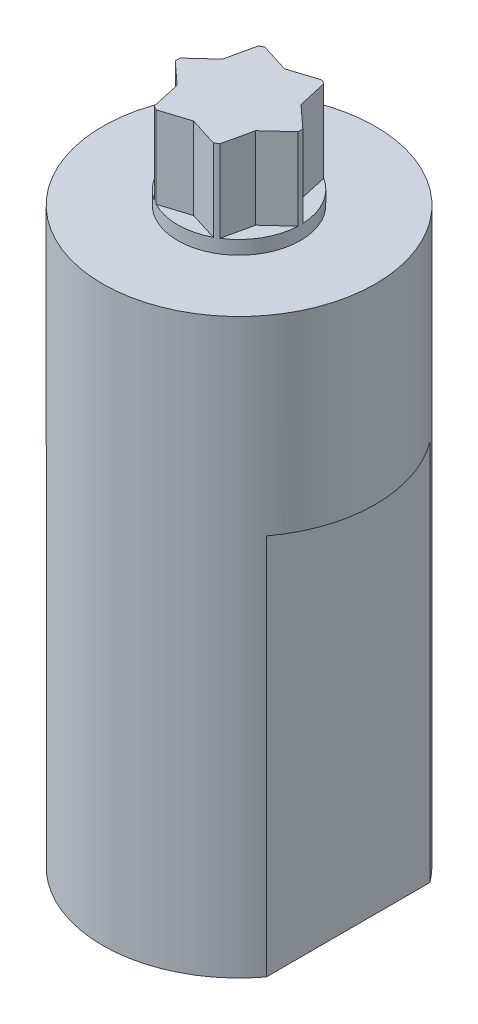
ISO-10303-21;
HEADER;
FILE_DESCRIPTION(('STEP AP214'),'2;1');
FILE_NAME('part.step','',(''),(''),'','','');
FILE_SCHEMA(('AUTOMOTIVE_DESIGN { 1 0 10303 214 1 1 1 1 }'));
ENDSEC;
DATA;
#1=APPLICATION_CONTEXT('core data for automotive mechanical design processes');
#2=APPLICATION_PROTOCOL_DEFINITION('international standard','automotive_design',2000,#1);
#3=PRODUCT_CONTEXT('',#1,'mechanical');
#4=PRODUCT('Part','Part','',(#3));
#5=PRODUCT_RELATED_PRODUCT_CATEGORY('part','',(#4));
#6=PRODUCT_DEFINITION_FORMATION('','',#4);
#7=PRODUCT_DEFINITION_CONTEXT('part definition',#1,'design');
#8=PRODUCT_DEFINITION('design','',#6,#7);
#9=PRODUCT_DEFINITION_SHAPE('','',#8);
#10=(LENGTH_UNIT() NAMED_UNIT(*) SI_UNIT(.MILLI.,.METRE.));
#11=(NAMED_UNIT(*) PLANE_ANGLE_UNIT() SI_UNIT($,.RADIAN.));
#12=(NAMED_UNIT(*) SI_UNIT($,.STERADIAN.) SOLID_ANGLE_UNIT());
#13=UNCERTAINTY_MEASURE_WITH_UNIT(LENGTH_MEASURE(1.E-05),#10,'distance_accuracy_value','');
#14=(GEOMETRIC_REPRESENTATION_CONTEXT(3) GLOBAL_UNCERTAINTY_ASSIGNED_CONTEXT((#13)) GLOBAL_UNIT_ASSIGNED_CONTEXT((#10,
#11,#12)) REPRESENTATION_CONTEXT('',''));
#15=CARTESIAN_POINT('',(0.,0.,0.));
#16=DIRECTION('',(0.,0.,1.));
#17=DIRECTION('',(1.,0.,0.));
#18=AXIS2_PLACEMENT_3D('',#15,#16,#17);
#19=CARTESIAN_POINT('',(0.,0.,0.));
#20=DIRECTION('',(0.,1.,0.));
#21=DIRECTION('',(0.,0.,1.));
#22=AXIS2_PLACEMENT_3D('',#19,#20,#21);
#23=PLANE('',#22);
#24=DIRECTION('',(0.,0.,-1.));
#25=VECTOR('',#24,1.);
#26=CARTESIAN_POINT('',(-4.,0.,0.));
#27=LINE('',#26,#25);
#28=CARTESIAN_POINT('',(-4.,0.,3.));
#29=VERTEX_POINT('',#28);
#30=CARTESIAN_POINT('',(-4.,0.,-3.));
#31=VERTEX_POINT('',#30);
#32=EDGE_CURVE('E300',#29,#31,#27,.T.);
#33=ORIENTED_EDGE('',*,*,#32,.F.);
#34=CARTESIAN_POINT('',(0.,0.,0.));
#35=DIRECTION('',(0.,1.,0.));
#36=DIRECTION('',(0.,0.,1.));
#37=AXIS2_PLACEMENT_3D('',#34,#35,#36);
#38=CIRCLE('',#37,5.);
#39=EDGE_CURVE('E315',#31,#29,#38,.T.);
#40=ORIENTED_EDGE('',*,*,#39,.F.);
#41=EDGE_LOOP('',(#33,#40));
#42=FACE_BOUND('',#41,.T.);
#43=ADVANCED_FACE('F33',(#42),#23,.F.);
#44=CARTESIAN_POINT('',(0.,7.,0.));
#45=DIRECTION('',(0.,-1.,0.));
#46=DIRECTION('',(0.,0.,-1.));
#47=AXIS2_PLACEMENT_3D('',#44,#45,#46);
#48=CYLINDRICAL_SURFACE('',#47,5.);
#49=CARTESIAN_POINT('',(0.,7.,0.));
#50=DIRECTION('',(0.,1.,0.));
#51=DIRECTION('',(0.,0.,1.));
#52=AXIS2_PLACEMENT_3D('',#49,#50,#51);
#53=CIRCLE('',#52,5.);
#54=CARTESIAN_POINT('',(0.,7.,5.));
#55=VERTEX_POINT('',#54);
#56=EDGE_CURVE('E324',#55,#55,#53,.T.);
#57=ORIENTED_EDGE('',*,*,#56,.F.);
#58=EDGE_LOOP('',(#57));
#59=FACE_BOUND('',#58,.T.);
#60=CARTESIAN_POINT('',(4.,0.,3.));
#61=VERTEX_POINT('',#60);
#62=CARTESIAN_POINT('',(4.,0.,-3.));
#63=VERTEX_POINT('',#62);
#64=EDGE_CURVE('E328',#61,#63,#38,.T.);
#65=ORIENTED_EDGE('',*,*,#64,.T.);
#66=DIRECTION('',(0.,1.,0.));
#67=VECTOR('',#66,1.);
#68=CARTESIAN_POINT('',(4.,-14.,-3.));
#69=LINE('',#68,#67);
#70=CARTESIAN_POINT('',(4.,-14.,-3.));
#71=VERTEX_POINT('',#70);
#72=EDGE_CURVE('E308',#71,#63,#69,.T.);
#73=ORIENTED_EDGE('',*,*,#72,.F.);
#74=CARTESIAN_POINT('',(0.,-14.,0.));
#75=DIRECTION('',(0.,1.,0.));
#76=DIRECTION('',(0.,0.,1.));
#77=AXIS2_PLACEMENT_3D('',#74,#75,#76);
#78=CIRCLE('',#77,5.);
#79=CARTESIAN_POINT('',(-4.,-14.,-3.));
#80=VERTEX_POINT('',#79);
#81=EDGE_CURVE('E299',#71,#80,#78,.T.);
#82=ORIENTED_EDGE('',*,*,#81,.T.);
#83=DIRECTION('',(0.,1.,0.));
#84=VECTOR('',#83,1.);
#85=CARTESIAN_POINT('',(-4.,-14.,-3.));
#86=LINE('',#85,#84);
#87=EDGE_CURVE('E319',#80,#31,#86,.T.);
#88=ORIENTED_EDGE('',*,*,#87,.T.);
#89=ORIENTED_EDGE('',*,*,#39,.T.);
#90=DIRECTION('',(0.,1.,0.));
#91=VECTOR('',#90,1.);
#92=CARTESIAN_POINT('',(-4.,-14.,3.));
#93=LINE('',#92,#91);
#94=CARTESIAN_POINT('',(-4.,-14.,3.));
#95=VERTEX_POINT('',#94);
#96=EDGE_CURVE('E316',#95,#29,#93,.T.);
#97=ORIENTED_EDGE('',*,*,#96,.F.);
#98=CARTESIAN_POINT('',(0.,-14.,0.));
#99=DIRECTION('',(0.,1.,0.));
#100=DIRECTION('',(0.,0.,1.));
#101=AXIS2_PLACEMENT_3D('',#98,#99,#100);
#102=CIRCLE('',#101,5.);
#103=CARTESIAN_POINT('',(4.,-14.,3.));
#104=VERTEX_POINT('',#103);
#105=EDGE_CURVE('E305',#95,#104,#102,.T.);
#106=ORIENTED_EDGE('',*,*,#105,.T.);
#107=DIRECTION('',(0.,1.,0.));
#108=VECTOR('',#107,1.);
#109=CARTESIAN_POINT('',(4.,-14.,3.));
#110=LINE('',#109,#108);
#111=EDGE_CURVE('E312',#104,#61,#110,.T.);
#112=ORIENTED_EDGE('',*,*,#111,.T.);
#113=EDGE_LOOP('',(#65,#73,#82,#88,#89,#97,#106,#112));
#114=FACE_BOUND('',#113,.T.);
#115=ADVANCED_FACE('F35',(#59,#114),#48,.T.);
#116=CARTESIAN_POINT('',(0.,7.,0.));
#117=DIRECTION('',(0.,1.,0.));
#118=DIRECTION('',(0.,0.,1.));
#119=AXIS2_PLACEMENT_3D('',#116,#117,#118);
#120=PLANE('',#119);
#121=CARTESIAN_POINT('',(0.,7.,0.));
#122=DIRECTION('',(0.,1.,0.));
#123=DIRECTION('',(0.,0.,1.));
#124=AXIS2_PLACEMENT_3D('',#121,#122,#123);
#125=CIRCLE('',#124,2.25);
#126=CARTESIAN_POINT('',(0.,7.,2.25));
#127=VERTEX_POINT('',#126);
#128=EDGE_CURVE('E287',#127,#127,#125,.T.);
#129=ORIENTED_EDGE('',*,*,#128,.F.);
#130=EDGE_LOOP('',(#129));
#131=FACE_BOUND('',#130,.T.);
#132=ORIENTED_EDGE('',*,*,#56,.T.);
#133=EDGE_LOOP('',(#132));
#134=FACE_BOUND('',#133,.T.);
#135=ADVANCED_FACE('F413',(#131,#134),#120,.T.);
#136=ORIENTED_EDGE('',*,*,#64,.F.);
#137=DIRECTION('',(0.,0.,-1.));
#138=VECTOR('',#137,1.);
#139=CARTESIAN_POINT('',(4.,0.,0.));
#140=LINE('',#139,#138);
#141=EDGE_CURVE('E291',#61,#63,#140,.T.);
#142=ORIENTED_EDGE('',*,*,#141,.T.);
#143=EDGE_LOOP('',(#136,#142));
#144=FACE_BOUND('',#143,.T.);
#145=ADVANCED_FACE('F409',(#144),#23,.F.);
#146=CARTESIAN_POINT('',(4.,-14.,0.));
#147=DIRECTION('',(1.,0.,0.));
#148=DIRECTION('',(0.,0.,-1.));
#149=AXIS2_PLACEMENT_3D('',#146,#147,#148);
#150=PLANE('',#149);
#151=ORIENTED_EDGE('',*,*,#141,.F.);
#152=ORIENTED_EDGE('',*,*,#111,.F.);
#153=DIRECTION('',(0.,0.,-1.));
#154=VECTOR('',#153,1.);
#155=CARTESIAN_POINT('',(4.,-14.,0.));
#156=LINE('',#155,#154);
#157=EDGE_CURVE('E296',#104,#71,#156,.T.);
#158=ORIENTED_EDGE('',*,*,#157,.T.);
#159=ORIENTED_EDGE('',*,*,#72,.T.);
#160=EDGE_LOOP('',(#151,#152,#158,#159));
#161=FACE_BOUND('',#160,.T.);
#162=ADVANCED_FACE('F417',(#161),#150,.T.);
#163=CARTESIAN_POINT('',(-4.,-14.,0.));
#164=DIRECTION('',(1.,0.,0.));
#165=DIRECTION('',(0.,0.,-1.));
#166=AXIS2_PLACEMENT_3D('',#163,#164,#165);
#167=PLANE('',#166);
#168=ORIENTED_EDGE('',*,*,#32,.T.);
#169=ORIENTED_EDGE('',*,*,#87,.F.);
#170=DIRECTION('',(0.,0.,-1.));
#171=VECTOR('',#170,1.);
#172=CARTESIAN_POINT('',(-4.,-14.,0.));
#173=LINE('',#172,#171);
#174=EDGE_CURVE('E303',#95,#80,#173,.T.);
#175=ORIENTED_EDGE('',*,*,#174,.F.);
#176=ORIENTED_EDGE('',*,*,#96,.T.);
#177=EDGE_LOOP('',(#168,#169,#175,#176));
#178=FACE_BOUND('',#177,.T.);
#179=ADVANCED_FACE('F423',(#178),#167,.F.);
#180=CARTESIAN_POINT('',(0.,-14.,0.));
#181=DIRECTION('',(0.,1.,0.));
#182=DIRECTION('',(0.,0.,1.));
#183=AXIS2_PLACEMENT_3D('',#180,#181,#182);
#184=PLANE('',#183);
#185=ORIENTED_EDGE('',*,*,#157,.F.);
#186=ORIENTED_EDGE('',*,*,#105,.F.);
#187=ORIENTED_EDGE('',*,*,#174,.T.);
#188=ORIENTED_EDGE('',*,*,#81,.F.);
#189=EDGE_LOOP('',(#185,#186,#187,#188));
#190=FACE_BOUND('',#189,.T.);
#191=ADVANCED_FACE('F433',(#190),#184,.F.);
#192=CARTESIAN_POINT('',(0.,10.5,0.));
#193=DIRECTION('',(0.,-1.,0.));
#194=DIRECTION('',(0.,0.,-1.));
#195=AXIS2_PLACEMENT_3D('',#192,#193,#194);
#196=CYLINDRICAL_SURFACE('',#195,2.25);
#197=CARTESIAN_POINT('',(0.,7.5,0.));
#198=DIRECTION('',(0.,-1.,0.));
#199=DIRECTION('',(0.,0.,-1.));
#200=AXIS2_PLACEMENT_3D('',#197,#198,#199);
#201=CIRCLE('',#200,2.25);
#202=CARTESIAN_POINT('',(-2.24821909810763,7.5,-0.0895035580527209));
#203=VERTEX_POINT('',#202);
#204=CARTESIAN_POINT('',(-1.20162190405658,7.5,-1.90226307320818));
#205=VERTEX_POINT('',#204);
#206=EDGE_CURVE('E11',#203,#205,#201,.T.);
#207=ORIENTED_EDGE('',*,*,#206,.T.);
#208=DIRECTION('',(0.,-1.,0.));
#209=VECTOR('',#208,1.);
#210=CARTESIAN_POINT('',(-1.20162190405658,10.5,-1.90226307320818));
#211=LINE('',#210,#209);
#212=CARTESIAN_POINT('',(-1.20162190405658,10.5,-1.90226307320818));
#213=VERTEX_POINT('',#212);
#214=EDGE_CURVE('E267',#205,#213,#211,.F.);
#215=ORIENTED_EDGE('',*,*,#214,.T.);
#216=CARTESIAN_POINT('',(0.,10.5,0.));
#217=DIRECTION('',(0.,1.,0.));
#218=DIRECTION('',(0.,0.,1.));
#219=AXIS2_PLACEMENT_3D('',#216,#217,#218);
#220=CIRCLE('',#219,2.25);
#221=CARTESIAN_POINT('',(-1.04659719405106,10.5,-1.99176663126091));
#222=VERTEX_POINT('',#221);
#223=EDGE_CURVE('E288',#222,#213,#220,.T.);
#224=ORIENTED_EDGE('',*,*,#223,.F.);
#225=DIRECTION('',(0.,-1.,0.));
#226=VECTOR('',#225,1.);
#227=CARTESIAN_POINT('',(-1.04659719405106,10.5,-1.99176663126091));
#228=LINE('',#227,#226);
#229=CARTESIAN_POINT('',(-1.04659719405106,7.5,-1.99176663126091));
#230=VERTEX_POINT('',#229);
#231=EDGE_CURVE('E281',#222,#230,#228,.T.);
#232=ORIENTED_EDGE('',*,*,#231,.T.);
#233=CARTESIAN_POINT('',(0.,7.5,0.));
#234=DIRECTION('',(0.,-1.,0.));
#235=DIRECTION('',(0.,0.,-1.));
#236=AXIS2_PLACEMENT_3D('',#233,#234,#235);
#237=CIRCLE('',#236,2.25);
#238=CARTESIAN_POINT('',(1.04659719405106,7.5,-1.99176663126091));
#239=VERTEX_POINT('',#238);
#240=EDGE_CURVE('E332',#230,#239,#237,.T.);
#241=ORIENTED_EDGE('',*,*,#240,.T.);
#242=DIRECTION('',(0.,-1.,0.));
#243=VECTOR('',#242,1.);
#244=CARTESIAN_POINT('',(1.04659719405106,10.5,-1.99176663126091));
#245=LINE('',#244,#243);
#246=CARTESIAN_POINT('',(1.04659719405106,10.5,-1.99176663126091));
#247=VERTEX_POINT('',#246);
#248=EDGE_CURVE('E284',#239,#247,#245,.F.);
#249=ORIENTED_EDGE('',*,*,#248,.T.);
#250=CARTESIAN_POINT('',(1.20162190405655,10.5,-1.9022630732082));
#251=VERTEX_POINT('',#250);
#252=EDGE_CURVE('E293',#251,#247,#220,.T.);
#253=ORIENTED_EDGE('',*,*,#252,.F.);
#254=DIRECTION('',(0.,-1.,0.));
#255=VECTOR('',#254,1.);
#256=CARTESIAN_POINT('',(1.20162190405655,10.5,-1.9022630732082));
#257=LINE('',#256,#255);
#258=CARTESIAN_POINT('',(1.20162190405655,7.5,-1.9022630732082));
#259=VERTEX_POINT('',#258);
#260=EDGE_CURVE('E250',#251,#259,#257,.T.);
#261=ORIENTED_EDGE('',*,*,#260,.T.);
#262=CARTESIAN_POINT('',(2.24821909810763,7.5,-0.0895035580527519));
#263=VERTEX_POINT('',#262);
#264=EDGE_CURVE('E189',#259,#263,#201,.T.);
#265=ORIENTED_EDGE('',*,*,#264,.T.);
#266=DIRECTION('',(0.,-1.,0.));
#267=VECTOR('',#266,1.);
#268=CARTESIAN_POINT('',(2.24821909810763,10.5,-0.0895035580527523));
#269=LINE('',#268,#267);
#270=CARTESIAN_POINT('',(2.24821909810763,10.5,-0.0895035580527519));
#271=VERTEX_POINT('',#270);
#272=EDGE_CURVE('E201',#263,#271,#269,.F.);
#273=ORIENTED_EDGE('',*,*,#272,.T.);
#274=CARTESIAN_POINT('',(2.24821909810763,10.5,0.0895035580527053));
#275=VERTEX_POINT('',#274);
#276=EDGE_CURVE('E374',#275,#271,#220,.T.);
#277=ORIENTED_EDGE('',*,*,#276,.F.);
#278=DIRECTION('',(0.,-1.,0.));
#279=VECTOR('',#278,1.);
#280=CARTESIAN_POINT('',(2.24821909810763,10.5,0.0895035580527053));
#281=LINE('',#280,#279);
#282=CARTESIAN_POINT('',(2.24821909810763,7.5,0.0895035580527054));
#283=VERTEX_POINT('',#282);
#284=EDGE_CURVE('E57',#275,#283,#281,.T.);
#285=ORIENTED_EDGE('',*,*,#284,.T.);
#286=CARTESIAN_POINT('',(1.20162190405659,7.5,1.90226307320818));
#287=VERTEX_POINT('',#286);
#288=EDGE_CURVE('E37',#283,#287,#201,.T.);
#289=ORIENTED_EDGE('',*,*,#288,.T.);
#290=DIRECTION('',(0.,-1.,0.));
#291=VECTOR('',#290,1.);
#292=CARTESIAN_POINT('',(1.20162190405659,10.5,1.90226307320818));
#293=LINE('',#292,#291);
#294=CARTESIAN_POINT('',(1.20162190405659,10.5,1.90226307320818));
#295=VERTEX_POINT('',#294);
#296=EDGE_CURVE('E246',#287,#295,#293,.F.);
#297=ORIENTED_EDGE('',*,*,#296,.T.);
#298=CARTESIAN_POINT('',(1.04659719405106,10.5,1.99176663126091));
#299=VERTEX_POINT('',#298);
#300=EDGE_CURVE('E371',#299,#295,#220,.T.);
#301=ORIENTED_EDGE('',*,*,#300,.F.);
#302=DIRECTION('',(0.,-1.,0.));
#303=VECTOR('',#302,1.);
#304=CARTESIAN_POINT('',(1.04659719405106,10.5,1.99176663126091));
#305=LINE('',#304,#303);
#306=CARTESIAN_POINT('',(1.04659719405106,7.5,1.99176663126091));
#307=VERTEX_POINT('',#306);
#308=EDGE_CURVE('E252',#299,#307,#305,.T.);
#309=ORIENTED_EDGE('',*,*,#308,.T.);
#310=CARTESIAN_POINT('',(-1.04659719405106,7.5,1.99176663126091));
#311=VERTEX_POINT('',#310);
#312=EDGE_CURVE('E347',#307,#311,#201,.T.);
#313=ORIENTED_EDGE('',*,*,#312,.T.);
#314=DIRECTION('',(0.,-1.,0.));
#315=VECTOR('',#314,1.);
#316=CARTESIAN_POINT('',(-1.04659719405106,10.5,1.99176663126091));
#317=LINE('',#316,#315);
#318=CARTESIAN_POINT('',(-1.04659719405106,10.5,1.99176663126091));
#319=VERTEX_POINT('',#318);
#320=EDGE_CURVE('E255',#311,#319,#317,.F.);
#321=ORIENTED_EDGE('',*,*,#320,.T.);
#322=CARTESIAN_POINT('',(-1.20162190405656,10.5,1.90226307320819));
#323=VERTEX_POINT('',#322);
#324=EDGE_CURVE('E370',#323,#319,#220,.T.);
#325=ORIENTED_EDGE('',*,*,#324,.F.);
#326=DIRECTION('',(0.,-1.,0.));
#327=VECTOR('',#326,1.);
#328=CARTESIAN_POINT('',(-1.20162190405656,10.5,1.90226307320819));
#329=LINE('',#328,#327);
#330=CARTESIAN_POINT('',(-1.20162190405656,7.5,1.90226307320819));
#331=VERTEX_POINT('',#330);
#332=EDGE_CURVE('E258',#323,#331,#329,.T.);
#333=ORIENTED_EDGE('',*,*,#332,.T.);
#334=CARTESIAN_POINT('',(-2.24821909810763,7.5,0.0895035580527376));
#335=VERTEX_POINT('',#334);
#336=EDGE_CURVE('E42',#331,#335,#201,.T.);
#337=ORIENTED_EDGE('',*,*,#336,.T.);
#338=DIRECTION('',(0.,-1.,0.));
#339=VECTOR('',#338,1.);
#340=CARTESIAN_POINT('',(-2.24821909810763,10.5,0.0895035580527369));
#341=LINE('',#340,#339);
#342=CARTESIAN_POINT('',(-2.24821909810763,10.5,0.0895035580527385));
#343=VERTEX_POINT('',#342);
#344=EDGE_CURVE('E261',#335,#343,#341,.F.);
#345=ORIENTED_EDGE('',*,*,#344,.T.);
#346=CARTESIAN_POINT('',(-2.24821909810763,10.5,-0.0895035580527207));
#347=VERTEX_POINT('',#346);
#348=EDGE_CURVE('E292',#347,#343,#220,.T.);
#349=ORIENTED_EDGE('',*,*,#348,.F.);
#350=DIRECTION('',(0.,-1.,0.));
#351=VECTOR('',#350,1.);
#352=CARTESIAN_POINT('',(-2.24821909810763,10.5,-0.0895035580527211));
#353=LINE('',#352,#351);
#354=EDGE_CURVE('E264',#347,#203,#353,.T.);
#355=ORIENTED_EDGE('',*,*,#354,.T.);
#356=EDGE_LOOP('',(#207,#215,#224,#232,#241,#249,#253,#261,#265,#273,#277,#285,#289,#297,#301,
#309,#313,#321,#325,#333,#337,#345,#349,#355));
#357=FACE_BOUND('',#356,.T.);
#358=ORIENTED_EDGE('',*,*,#128,.T.);
#359=EDGE_LOOP('',(#358));
#360=FACE_BOUND('',#359,.T.);
#361=ADVANCED_FACE('F350',(#357,#360),#196,.T.);
#362=CARTESIAN_POINT('',(0.,10.5,0.));
#363=DIRECTION('',(0.,1.,0.));
#364=DIRECTION('',(0.,0.,1.));
#365=AXIS2_PLACEMENT_3D('',#362,#363,#364);
#366=PLANE('',#365);
#367=DIRECTION('',(0.217052904017069,0.,-0.976159841858779));
#368=VECTOR('',#367,1.);
#369=CARTESIAN_POINT('',(-0.0950540603573062,10.5,-6.87887048697743));
#370=LINE('',#369,#368);
#371=CARTESIAN_POINT('',(-1.43976595402315,10.5,-0.831249261125319));
#372=VERTEX_POINT('',#371);
#373=EDGE_CURVE('E235',#372,#213,#370,.T.);
#374=ORIENTED_EDGE('',*,*,#373,.F.);
#375=DIRECTION('',(0.736852769195366,0.,-0.67605324977336));
#376=VECTOR('',#375,1.);
#377=CARTESIAN_POINT('',(-1.07213038497375,10.5,-1.16855032258367));
#378=LINE('',#377,#376);
#379=EDGE_CURVE('E341',#347,#372,#378,.T.);
#380=ORIENTED_EDGE('',*,*,#379,.F.);
#381=ORIENTED_EDGE('',*,*,#348,.T.);
#382=DIRECTION('',(-0.73685276919537,0.,-0.676053249773355));
#383=VECTOR('',#382,1.);
#384=CARTESIAN_POINT('',(-6.00480362124415,10.5,-3.35711601248642));
#385=LINE('',#384,#383);
#386=CARTESIAN_POINT('',(-1.43976595402314,10.5,0.831249261125329));
#387=VERTEX_POINT('',#386);
#388=EDGE_CURVE('E225',#387,#343,#385,.T.);
#389=ORIENTED_EDGE('',*,*,#388,.F.);
#390=DIRECTION('',(-0.217052904017076,0.,-0.976159841858778));
#391=VECTOR('',#390,1.);
#392=CARTESIAN_POINT('',(-1.54805945744484,10.5,0.344216988264624));
#393=LINE('',#392,#391);
#394=EDGE_CURVE('E340',#323,#387,#393,.T.);
#395=ORIENTED_EDGE('',*,*,#394,.F.);
#396=ORIENTED_EDGE('',*,*,#324,.T.);
#397=DIRECTION('',(-0.953905673212438,0.,0.30010659208542));
#398=VECTOR('',#397,1.);
#399=CARTESIAN_POINT('',(-5.90974956088685,10.5,3.52175447449099));
#400=LINE('',#399,#398);
#401=CARTESIAN_POINT('',(0.,10.5,1.66249852225064));
#402=VERTEX_POINT('',#401);
#403=EDGE_CURVE('E215',#402,#319,#400,.T.);
#404=ORIENTED_EDGE('',*,*,#403,.F.);
#405=DIRECTION('',(-0.953905673212438,0.,-0.30010659208542));
#406=VECTOR('',#405,1.);
#407=CARTESIAN_POINT('',(-0.47592907247109,10.5,1.51276731084829));
#408=LINE('',#407,#406);
#409=EDGE_CURVE('E338',#299,#402,#408,.T.);
#410=ORIENTED_EDGE('',*,*,#409,.F.);
#411=ORIENTED_EDGE('',*,*,#300,.T.);
#412=DIRECTION('',(-0.217052904017062,0.,0.976159841858781));
#413=VECTOR('',#412,1.);
#414=CARTESIAN_POINT('',(0.0950540603573543,10.5,6.87887048697743));
#415=LINE('',#414,#413);
#416=CARTESIAN_POINT('',(1.43976595402315,10.5,0.831249261125309));
#417=VERTEX_POINT('',#416);
#418=EDGE_CURVE('E197',#417,#295,#415,.T.);
#419=ORIENTED_EDGE('',*,*,#418,.F.);
#420=DIRECTION('',(-0.736852769195361,0.,0.676053249773365));
#421=VECTOR('',#420,1.);
#422=CARTESIAN_POINT('',(1.07213038497376,10.5,1.16855032258367));
#423=LINE('',#422,#421);
#424=EDGE_CURVE('E335',#275,#417,#423,.T.);
#425=ORIENTED_EDGE('',*,*,#424,.F.);
#426=ORIENTED_EDGE('',*,*,#276,.T.);
#427=DIRECTION('',(0.736852769195375,0.,0.67605324977335));
#428=VECTOR('',#427,1.);
#429=CARTESIAN_POINT('',(6.00480362124418,10.5,3.35711601248637));
#430=LINE('',#429,#428);
#431=CARTESIAN_POINT('',(1.43976595402314,10.5,-0.831249261125338));
#432=VERTEX_POINT('',#431);
#433=EDGE_CURVE('E202',#432,#271,#430,.T.);
#434=ORIENTED_EDGE('',*,*,#433,.F.);
#435=DIRECTION('',(0.217052904017083,0.,0.976159841858776));
#436=VECTOR('',#435,1.);
#437=CARTESIAN_POINT('',(1.54805945744483,10.5,-0.344216988264635));
#438=LINE('',#437,#436);
#439=EDGE_CURVE('E195',#251,#432,#438,.T.);
#440=ORIENTED_EDGE('',*,*,#439,.F.);
#441=ORIENTED_EDGE('',*,*,#252,.T.);
#442=DIRECTION('',(0.953905673212438,0.,-0.30010659208542));
#443=VECTOR('',#442,1.);
#444=CARTESIAN_POINT('',(5.90974956088685,10.5,-3.52175447449099));
#445=LINE('',#444,#443);
#446=CARTESIAN_POINT('',(0.,10.5,-1.66249852225064));
#447=VERTEX_POINT('',#446);
#448=EDGE_CURVE('E270',#447,#247,#445,.T.);
#449=ORIENTED_EDGE('',*,*,#448,.F.);
#450=DIRECTION('',(0.953905673212438,0.,0.30010659208542));
#451=VECTOR('',#450,1.);
#452=CARTESIAN_POINT('',(0.47592907247109,10.5,-1.51276731084829));
#453=LINE('',#452,#451);
#454=EDGE_CURVE('E327',#222,#447,#453,.T.);
#455=ORIENTED_EDGE('',*,*,#454,.F.);
#456=ORIENTED_EDGE('',*,*,#223,.T.);
#457=EDGE_LOOP('',(#374,#380,#381,#389,#395,#396,#404,#410,#411,#419,#425,#426,#434,#440,#441,
#449,#455,#456));
#458=FACE_BOUND('',#457,.T.);
#459=ADVANCED_FACE('F368',(#458),#366,.T.);
#460=CARTESIAN_POINT('',(0.,7.5,0.));
#461=DIRECTION('',(0.,-1.,0.));
#462=DIRECTION('',(0.,0.,-1.));
#463=AXIS2_PLACEMENT_3D('',#460,#461,#462);
#464=PLANE('',#463);
#465=DIRECTION('',(0.953905673212438,0.,0.30010659208542));
#466=VECTOR('',#465,1.);
#467=CARTESIAN_POINT('',(0.,7.5,-1.66249852225064));
#468=LINE('',#467,#466);
#469=CARTESIAN_POINT('',(0.,7.5,-1.66249852225064));
#470=VERTEX_POINT('',#469);
#471=EDGE_CURVE('E274',#230,#470,#468,.T.);
#472=ORIENTED_EDGE('',*,*,#471,.T.);
#473=DIRECTION('',(0.953905673212438,0.,-0.30010659208542));
#474=VECTOR('',#473,1.);
#475=CARTESIAN_POINT('',(5.90974956088685,7.5,-3.52175447449099));
#476=LINE('',#475,#474);
#477=EDGE_CURVE('E271',#470,#239,#476,.T.);
#478=ORIENTED_EDGE('',*,*,#477,.T.);
#479=ORIENTED_EDGE('',*,*,#240,.F.);
#480=EDGE_LOOP('',(#472,#478,#479));
#481=FACE_BOUND('',#480,.T.);
#482=ADVANCED_FACE('F390',(#481),#464,.F.);
#483=CARTESIAN_POINT('',(5.90974956088685,7.5,-3.52175447449099));
#484=DIRECTION('',(0.30010659208542,0.,0.953905673212438));
#485=DIRECTION('',(0.953905673212438,0.,-0.30010659208542));
#486=AXIS2_PLACEMENT_3D('',#483,#484,#485);
#487=PLANE('',#486);
#488=ORIENTED_EDGE('',*,*,#477,.F.);
#489=DIRECTION('',(0.,1.,0.));
#490=VECTOR('',#489,1.);
#491=CARTESIAN_POINT('',(0.,7.5,-1.66249852225064));
#492=LINE('',#491,#490);
#493=EDGE_CURVE('E276',#470,#447,#492,.T.);
#494=ORIENTED_EDGE('',*,*,#493,.T.);
#495=ORIENTED_EDGE('',*,*,#448,.T.);
#496=ORIENTED_EDGE('',*,*,#248,.F.);
#497=EDGE_LOOP('',(#488,#494,#495,#496));
#498=FACE_BOUND('',#497,.T.);
#499=ADVANCED_FACE('F385',(#498),#487,.F.);
#500=CARTESIAN_POINT('',(0.,7.5,-1.66249852225064));
#501=DIRECTION('',(-0.30010659208542,0.,0.953905673212438));
#502=DIRECTION('',(0.953905673212438,0.,0.30010659208542));
#503=AXIS2_PLACEMENT_3D('',#500,#501,#502);
#504=PLANE('',#503);
#505=ORIENTED_EDGE('',*,*,#454,.T.);
#506=ORIENTED_EDGE('',*,*,#493,.F.);
#507=ORIENTED_EDGE('',*,*,#471,.F.);
#508=ORIENTED_EDGE('',*,*,#231,.F.);
#509=EDGE_LOOP('',(#505,#506,#507,#508));
#510=FACE_BOUND('',#509,.T.);
#511=ADVANCED_FACE('F392',(#510),#504,.F.);
#512=CARTESIAN_POINT('',(1.43976595402315,7.5,0.831249261125309));
#513=DIRECTION('',(-0.676053249773365,0.,-0.736852769195361));
#514=DIRECTION('',(-0.736852769195361,0.,0.676053249773365));
#515=AXIS2_PLACEMENT_3D('',#512,#513,#514);
#516=PLANE('',#515);
#517=ORIENTED_EDGE('',*,*,#424,.T.);
#518=DIRECTION('',(0.,1.,0.));
#519=VECTOR('',#518,1.);
#520=CARTESIAN_POINT('',(1.43976595402315,7.5,0.831249261125309));
#521=LINE('',#520,#519);
#522=CARTESIAN_POINT('',(1.43976595402315,7.5,0.831249261125309));
#523=VERTEX_POINT('',#522);
#524=EDGE_CURVE('E211',#523,#417,#521,.T.);
#525=ORIENTED_EDGE('',*,*,#524,.F.);
#526=DIRECTION('',(-0.736852769195361,0.,0.676053249773365));
#527=VECTOR('',#526,1.);
#528=CARTESIAN_POINT('',(1.43976595402315,7.5,0.831249261125309));
#529=LINE('',#528,#527);
#530=EDGE_CURVE('E209',#283,#523,#529,.T.);
#531=ORIENTED_EDGE('',*,*,#530,.F.);
#532=ORIENTED_EDGE('',*,*,#284,.F.);
#533=EDGE_LOOP('',(#517,#525,#531,#532));
#534=FACE_BOUND('',#533,.T.);
#535=ADVANCED_FACE('F453',(#534),#516,.F.);
#536=CARTESIAN_POINT('',(0.0950540603573543,7.5,6.87887048697743));
#537=DIRECTION('',(-0.976159841858781,0.,-0.217052904017062));
#538=DIRECTION('',(-0.217052904017062,0.,0.976159841858781));
#539=AXIS2_PLACEMENT_3D('',#536,#537,#538);
#540=PLANE('',#539);
#541=DIRECTION('',(-0.217052904017062,0.,0.976159841858781));
#542=VECTOR('',#541,1.);
#543=CARTESIAN_POINT('',(0.0950540603573543,7.5,6.87887048697743));
#544=LINE('',#543,#542);
#545=EDGE_CURVE('E206',#523,#287,#544,.T.);
#546=ORIENTED_EDGE('',*,*,#545,.F.);
#547=ORIENTED_EDGE('',*,*,#524,.T.);
#548=ORIENTED_EDGE('',*,*,#418,.T.);
#549=ORIENTED_EDGE('',*,*,#296,.F.);
#550=EDGE_LOOP('',(#546,#547,#548,#549));
#551=FACE_BOUND('',#550,.T.);
#552=ADVANCED_FACE('F475',(#551),#540,.F.);
#553=CARTESIAN_POINT('',(0.,7.5,0.));
#554=DIRECTION('',(0.,-1.,0.));
#555=DIRECTION('',(-0.86602540378444,0.,-0.499999999999998));
#556=AXIS2_PLACEMENT_3D('',#553,#554,#555);
#557=PLANE('',#556);
#558=ORIENTED_EDGE('',*,*,#530,.T.);
#559=ORIENTED_EDGE('',*,*,#545,.T.);
#560=ORIENTED_EDGE('',*,*,#288,.F.);
#561=EDGE_LOOP('',(#558,#559,#560));
#562=FACE_BOUND('',#561,.T.);
#563=ADVANCED_FACE('F482',(#562),#557,.F.);
#564=CARTESIAN_POINT('',(6.00480362124418,7.5,3.35711601248637));
#565=DIRECTION('',(-0.67605324977335,0.,0.736852769195375));
#566=DIRECTION('',(0.736852769195375,0.,0.67605324977335));
#567=AXIS2_PLACEMENT_3D('',#564,#565,#566);
#568=PLANE('',#567);
#569=DIRECTION('',(0.736852769195375,0.,0.67605324977335));
#570=VECTOR('',#569,1.);
#571=CARTESIAN_POINT('',(6.00480362124418,7.5,3.35711601248637));
#572=LINE('',#571,#570);
#573=CARTESIAN_POINT('',(1.43976595402314,7.5,-0.831249261125339));
#574=VERTEX_POINT('',#573);
#575=EDGE_CURVE('E187',#574,#263,#572,.T.);
#576=ORIENTED_EDGE('',*,*,#575,.F.);
#577=DIRECTION('',(0.,1.,0.));
#578=VECTOR('',#577,1.);
#579=CARTESIAN_POINT('',(1.43976595402314,7.5,-0.831249261125339));
#580=LINE('',#579,#578);
#581=EDGE_CURVE('E49',#574,#432,#580,.T.);
#582=ORIENTED_EDGE('',*,*,#581,.T.);
#583=ORIENTED_EDGE('',*,*,#433,.T.);
#584=ORIENTED_EDGE('',*,*,#272,.F.);
#585=EDGE_LOOP('',(#576,#582,#583,#584));
#586=FACE_BOUND('',#585,.T.);
#587=ADVANCED_FACE('F199',(#586),#568,.F.);
#588=CARTESIAN_POINT('',(1.43976595402314,7.5,-0.831249261125339));
#589=DIRECTION('',(-0.976159841858776,0.,0.217052904017083));
#590=DIRECTION('',(0.217052904017083,0.,0.976159841858776));
#591=AXIS2_PLACEMENT_3D('',#588,#589,#590);
#592=PLANE('',#591);
#593=ORIENTED_EDGE('',*,*,#439,.T.);
#594=ORIENTED_EDGE('',*,*,#581,.F.);
#595=DIRECTION('',(0.217052904017083,0.,0.976159841858776));
#596=VECTOR('',#595,1.);
#597=CARTESIAN_POINT('',(1.43976595402314,7.5,-0.831249261125339));
#598=LINE('',#597,#596);
#599=EDGE_CURVE('E185',#259,#574,#598,.T.);
#600=ORIENTED_EDGE('',*,*,#599,.F.);
#601=ORIENTED_EDGE('',*,*,#260,.F.);
#602=EDGE_LOOP('',(#593,#594,#600,#601));
#603=FACE_BOUND('',#602,.T.);
#604=ADVANCED_FACE('F193',(#603),#592,.F.);
#605=ORIENTED_EDGE('',*,*,#599,.T.);
#606=ORIENTED_EDGE('',*,*,#575,.T.);
#607=ORIENTED_EDGE('',*,*,#264,.F.);
#608=EDGE_LOOP('',(#605,#606,#607));
#609=FACE_BOUND('',#608,.T.);
#610=ADVANCED_FACE('F186',(#609),#557,.F.);
#611=CARTESIAN_POINT('',(0.,7.5,1.66249852225064));
#612=DIRECTION('',(0.30010659208542,0.,-0.953905673212438));
#613=DIRECTION('',(-0.953905673212438,0.,-0.30010659208542));
#614=AXIS2_PLACEMENT_3D('',#611,#612,#613);
#615=PLANE('',#614);
#616=ORIENTED_EDGE('',*,*,#409,.T.);
#617=DIRECTION('',(0.,1.,0.));
#618=VECTOR('',#617,1.);
#619=CARTESIAN_POINT('',(0.,7.5,1.66249852225064));
#620=LINE('',#619,#618);
#621=CARTESIAN_POINT('',(0.,7.5,1.66249852225064));
#622=VERTEX_POINT('',#621);
#623=EDGE_CURVE('E221',#622,#402,#620,.T.);
#624=ORIENTED_EDGE('',*,*,#623,.F.);
#625=DIRECTION('',(-0.953905673212438,0.,-0.30010659208542));
#626=VECTOR('',#625,1.);
#627=CARTESIAN_POINT('',(0.,7.5,1.66249852225064));
#628=LINE('',#627,#626);
#629=EDGE_CURVE('E219',#307,#622,#628,.T.);
#630=ORIENTED_EDGE('',*,*,#629,.F.);
#631=ORIENTED_EDGE('',*,*,#308,.F.);
#632=EDGE_LOOP('',(#616,#624,#630,#631));
#633=FACE_BOUND('',#632,.T.);
#634=ADVANCED_FACE('F509',(#633),#615,.F.);
#635=CARTESIAN_POINT('',(-5.90974956088685,7.5,3.52175447449099));
#636=DIRECTION('',(-0.30010659208542,0.,-0.953905673212438));
#637=DIRECTION('',(-0.953905673212438,0.,0.30010659208542));
#638=AXIS2_PLACEMENT_3D('',#635,#636,#637);
#639=PLANE('',#638);
#640=DIRECTION('',(-0.953905673212438,0.,0.30010659208542));
#641=VECTOR('',#640,1.);
#642=CARTESIAN_POINT('',(-5.90974956088685,7.5,3.52175447449099));
#643=LINE('',#642,#641);
#644=EDGE_CURVE('E216',#622,#311,#643,.T.);
#645=ORIENTED_EDGE('',*,*,#644,.F.);
#646=ORIENTED_EDGE('',*,*,#623,.T.);
#647=ORIENTED_EDGE('',*,*,#403,.T.);
#648=ORIENTED_EDGE('',*,*,#320,.F.);
#649=EDGE_LOOP('',(#645,#646,#647,#648));
#650=FACE_BOUND('',#649,.T.);
#651=ADVANCED_FACE('F515',(#650),#639,.F.);
#652=ORIENTED_EDGE('',*,*,#629,.T.);
#653=ORIENTED_EDGE('',*,*,#644,.T.);
#654=ORIENTED_EDGE('',*,*,#312,.F.);
#655=EDGE_LOOP('',(#652,#653,#654));
#656=FACE_BOUND('',#655,.T.);
#657=ADVANCED_FACE('F491',(#656),#557,.F.);
#658=CARTESIAN_POINT('',(-1.43976595402314,7.5,0.831249261125329));
#659=DIRECTION('',(0.976159841858778,0.,-0.217052904017076));
#660=DIRECTION('',(-0.217052904017076,0.,-0.976159841858778));
#661=AXIS2_PLACEMENT_3D('',#658,#659,#660);
#662=PLANE('',#661);
#663=ORIENTED_EDGE('',*,*,#394,.T.);
#664=DIRECTION('',(0.,1.,0.));
#665=VECTOR('',#664,1.);
#666=CARTESIAN_POINT('',(-1.43976595402314,7.5,0.831249261125329));
#667=LINE('',#666,#665);
#668=CARTESIAN_POINT('',(-1.43976595402314,7.5,0.831249261125329));
#669=VERTEX_POINT('',#668);
#670=EDGE_CURVE('E231',#669,#387,#667,.T.);
#671=ORIENTED_EDGE('',*,*,#670,.F.);
#672=DIRECTION('',(-0.217052904017076,0.,-0.976159841858778));
#673=VECTOR('',#672,1.);
#674=CARTESIAN_POINT('',(-1.43976595402314,7.5,0.831249261125329));
#675=LINE('',#674,#673);
#676=EDGE_CURVE('E229',#331,#669,#675,.T.);
#677=ORIENTED_EDGE('',*,*,#676,.F.);
#678=ORIENTED_EDGE('',*,*,#332,.F.);
#679=EDGE_LOOP('',(#663,#671,#677,#678));
#680=FACE_BOUND('',#679,.T.);
#681=ADVANCED_FACE('F361',(#680),#662,.F.);
#682=CARTESIAN_POINT('',(-6.00480362124415,7.5,-3.35711601248642));
#683=DIRECTION('',(0.676053249773355,0.,-0.73685276919537));
#684=DIRECTION('',(-0.73685276919537,0.,-0.676053249773355));
#685=AXIS2_PLACEMENT_3D('',#682,#683,#684);
#686=PLANE('',#685);
#687=DIRECTION('',(-0.73685276919537,0.,-0.676053249773355));
#688=VECTOR('',#687,1.);
#689=CARTESIAN_POINT('',(-6.00480362124415,7.5,-3.35711601248642));
#690=LINE('',#689,#688);
#691=EDGE_CURVE('E226',#669,#335,#690,.T.);
#692=ORIENTED_EDGE('',*,*,#691,.F.);
#693=ORIENTED_EDGE('',*,*,#670,.T.);
#694=ORIENTED_EDGE('',*,*,#388,.T.);
#695=ORIENTED_EDGE('',*,*,#344,.F.);
#696=EDGE_LOOP('',(#692,#693,#694,#695));
#697=FACE_BOUND('',#696,.T.);
#698=ADVANCED_FACE('F365',(#697),#686,.F.);
#699=ORIENTED_EDGE('',*,*,#676,.T.);
#700=ORIENTED_EDGE('',*,*,#691,.T.);
#701=ORIENTED_EDGE('',*,*,#336,.F.);
#702=EDGE_LOOP('',(#699,#700,#701));
#703=FACE_BOUND('',#702,.T.);
#704=ADVANCED_FACE('F357',(#703),#557,.F.);
#705=DIRECTION('',(0.736852769195366,0.,-0.67605324977336));
#706=VECTOR('',#705,1.);
#707=CARTESIAN_POINT('',(-1.43976595402315,7.5,-0.831249261125319));
#708=LINE('',#707,#706);
#709=CARTESIAN_POINT('',(-1.43976595402315,7.5,-0.831249261125319));
#710=VERTEX_POINT('',#709);
#711=EDGE_CURVE('E239',#203,#710,#708,.T.);
#712=ORIENTED_EDGE('',*,*,#711,.T.);
#713=DIRECTION('',(0.217052904017069,0.,-0.976159841858779));
#714=VECTOR('',#713,1.);
#715=CARTESIAN_POINT('',(-0.0950540603573062,7.5,-6.87887048697743));
#716=LINE('',#715,#714);
#717=EDGE_CURVE('E236',#710,#205,#716,.T.);
#718=ORIENTED_EDGE('',*,*,#717,.T.);
#719=ORIENTED_EDGE('',*,*,#206,.F.);
#720=EDGE_LOOP('',(#712,#718,#719));
#721=FACE_BOUND('',#720,.T.);
#722=ADVANCED_FACE('F397',(#721),#557,.F.);
#723=CARTESIAN_POINT('',(-0.0950540603573062,7.5,-6.87887048697743));
#724=DIRECTION('',(0.976159841858779,0.,0.217052904017069));
#725=DIRECTION('',(0.217052904017069,0.,-0.976159841858779));
#726=AXIS2_PLACEMENT_3D('',#723,#724,#725);
#727=PLANE('',#726);
#728=ORIENTED_EDGE('',*,*,#717,.F.);
#729=DIRECTION('',(0.,1.,0.));
#730=VECTOR('',#729,1.);
#731=CARTESIAN_POINT('',(-1.43976595402315,7.5,-0.831249261125319));
#732=LINE('',#731,#730);
#733=EDGE_CURVE('E241',#710,#372,#732,.T.);
#734=ORIENTED_EDGE('',*,*,#733,.T.);
#735=ORIENTED_EDGE('',*,*,#373,.T.);
#736=ORIENTED_EDGE('',*,*,#214,.F.);
#737=EDGE_LOOP('',(#728,#734,#735,#736));
#738=FACE_BOUND('',#737,.T.);
#739=ADVANCED_FACE('F395',(#738),#727,.F.);
#740=CARTESIAN_POINT('',(-1.43976595402315,7.5,-0.831249261125319));
#741=DIRECTION('',(0.67605324977336,0.,0.736852769195366));
#742=DIRECTION('',(0.736852769195366,0.,-0.67605324977336));
#743=AXIS2_PLACEMENT_3D('',#740,#741,#742);
#744=PLANE('',#743);
#745=ORIENTED_EDGE('',*,*,#379,.T.);
#746=ORIENTED_EDGE('',*,*,#733,.F.);
#747=ORIENTED_EDGE('',*,*,#711,.F.);
#748=ORIENTED_EDGE('',*,*,#354,.F.);
#749=EDGE_LOOP('',(#745,#746,#747,#748));
#750=FACE_BOUND('',#749,.T.);
#751=ADVANCED_FACE('F399',(#750),#744,.F.);
#752=CLOSED_SHELL('',(#43,#115,#135,#145,#162,#179,#191,#361,#459,#482,#499,#511,#535,#552,#563,
#587,#604,#610,#634,#651,#657,#681,#698,#704,#722,#739,#751));
#753=MANIFOLD_SOLID_BREP('B2',#752);
#754=ADVANCED_BREP_SHAPE_REPRESENTATION('',(#18,#753),#14);
#755=SHAPE_DEFINITION_REPRESENTATION(#9,#754);
ENDSEC;
END-ISO-10303-21;
